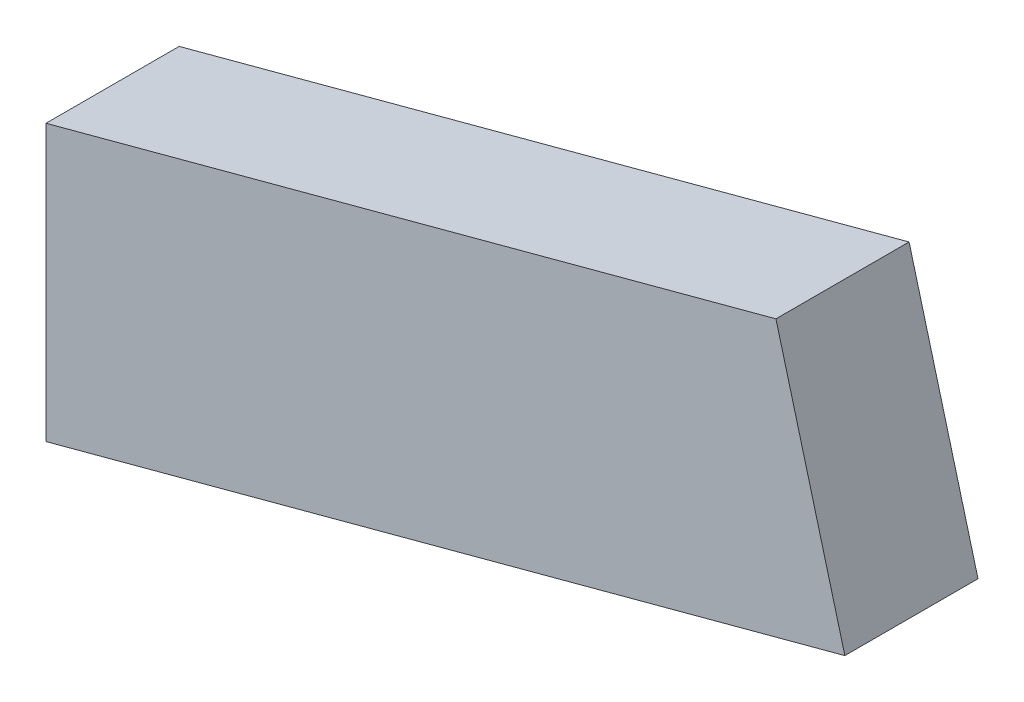
ISO-10303-21;
HEADER;
FILE_DESCRIPTION(('STEP AP214'),'2;1');
FILE_NAME('part.step','',(''),(''),'','','');
FILE_SCHEMA(('AUTOMOTIVE_DESIGN { 1 0 10303 214 1 1 1 1 }'));
ENDSEC;
DATA;
#1=APPLICATION_CONTEXT('core data for automotive mechanical design processes');
#2=APPLICATION_PROTOCOL_DEFINITION('international standard','automotive_design',2000,#1);
#3=PRODUCT_CONTEXT('',#1,'mechanical');
#4=PRODUCT('Part','Part','',(#3));
#5=PRODUCT_RELATED_PRODUCT_CATEGORY('part','',(#4));
#6=PRODUCT_DEFINITION_FORMATION('','',#4);
#7=PRODUCT_DEFINITION_CONTEXT('part definition',#1,'design');
#8=PRODUCT_DEFINITION('design','',#6,#7);
#9=PRODUCT_DEFINITION_SHAPE('','',#8);
#10=(LENGTH_UNIT() NAMED_UNIT(*) SI_UNIT(.MILLI.,.METRE.));
#11=(NAMED_UNIT(*) PLANE_ANGLE_UNIT() SI_UNIT($,.RADIAN.));
#12=(NAMED_UNIT(*) SI_UNIT($,.STERADIAN.) SOLID_ANGLE_UNIT());
#13=UNCERTAINTY_MEASURE_WITH_UNIT(LENGTH_MEASURE(1.E-05),#10,'distance_accuracy_value','');
#14=(GEOMETRIC_REPRESENTATION_CONTEXT(3) GLOBAL_UNCERTAINTY_ASSIGNED_CONTEXT((#13)) GLOBAL_UNIT_ASSIGNED_CONTEXT((#10,
#11,#12)) REPRESENTATION_CONTEXT('',''));
#15=CARTESIAN_POINT('',(0.,0.,0.));
#16=DIRECTION('',(0.,0.,1.));
#17=DIRECTION('',(1.,0.,0.));
#18=AXIS2_PLACEMENT_3D('',#15,#16,#17);
#19=CARTESIAN_POINT('',(0.,0.,0.5));
#20=DIRECTION('',(-0.258819045102525,0.965925826289067,0.));
#21=DIRECTION('',(-0.965925826289067,-0.258819045102525,0.));
#22=AXIS2_PLACEMENT_3D('',#19,#20,#21);
#23=PLANE('',#22);
#24=DIRECTION('',(0.965925826289067,0.258819045102525,0.));
#25=VECTOR('',#24,1.);
#26=CARTESIAN_POINT('',(0.,0.,0.));
#27=LINE('',#26,#25);
#28=CARTESIAN_POINT('',(0.,0.,0.));
#29=VERTEX_POINT('',#28);
#30=CARTESIAN_POINT('',(3.,0.803847577293382,0.));
#31=VERTEX_POINT('',#30);
#32=EDGE_CURVE('E100',#29,#31,#27,.T.);
#33=ORIENTED_EDGE('',*,*,#32,.T.);
#34=DIRECTION('',(0.,0.,-1.));
#35=VECTOR('',#34,1.);
#36=CARTESIAN_POINT('',(3.,0.803847577293382,0.5));
#37=LINE('',#36,#35);
#38=CARTESIAN_POINT('',(3.,0.803847577293382,0.5));
#39=VERTEX_POINT('',#38);
#40=EDGE_CURVE('E11',#39,#31,#37,.T.);
#41=ORIENTED_EDGE('',*,*,#40,.F.);
#42=DIRECTION('',(0.965925826289067,0.258819045102525,0.));
#43=VECTOR('',#42,1.);
#44=CARTESIAN_POINT('',(0.,0.,0.5));
#45=LINE('',#44,#43);
#46=CARTESIAN_POINT('',(0.,0.,0.5));
#47=VERTEX_POINT('',#46);
#48=EDGE_CURVE('E88',#47,#39,#45,.T.);
#49=ORIENTED_EDGE('',*,*,#48,.F.);
#50=DIRECTION('',(0.,0.,-1.));
#51=VECTOR('',#50,1.);
#52=CARTESIAN_POINT('',(0.,0.,0.5));
#53=LINE('',#52,#51);
#54=EDGE_CURVE('E96',#47,#29,#53,.T.);
#55=ORIENTED_EDGE('',*,*,#54,.T.);
#56=EDGE_LOOP('',(#33,#41,#49,#55));
#57=FACE_BOUND('',#56,.T.);
#58=ADVANCED_FACE('F37',(#57),#23,.F.);
#59=CARTESIAN_POINT('',(3.,0.803847577293382,0.5));
#60=DIRECTION('',(-0.965925826289067,-0.258819045102525,0.));
#61=DIRECTION('',(0.258819045102525,-0.965925826289067,0.));
#62=AXIS2_PLACEMENT_3D('',#59,#60,#61);
#63=PLANE('',#62);
#64=DIRECTION('',(-0.258819045102525,0.965925826289067,0.));
#65=VECTOR('',#64,1.);
#66=CARTESIAN_POINT('',(3.,0.803847577293382,0.));
#67=LINE('',#66,#65);
#68=CARTESIAN_POINT('',(2.74118095489748,1.76977340358245,0.));
#69=VERTEX_POINT('',#68);
#70=EDGE_CURVE('E92',#31,#69,#67,.T.);
#71=ORIENTED_EDGE('',*,*,#70,.T.);
#72=DIRECTION('',(0.,0.,-1.));
#73=VECTOR('',#72,1.);
#74=CARTESIAN_POINT('',(2.74118095489748,1.76977340358245,0.5));
#75=LINE('',#74,#73);
#76=CARTESIAN_POINT('',(2.74118095489748,1.76977340358245,0.5));
#77=VERTEX_POINT('',#76);
#78=EDGE_CURVE('E45',#77,#69,#75,.T.);
#79=ORIENTED_EDGE('',*,*,#78,.F.);
#80=DIRECTION('',(-0.258819045102525,0.965925826289067,0.));
#81=VECTOR('',#80,1.);
#82=CARTESIAN_POINT('',(3.,0.803847577293382,0.5));
#83=LINE('',#82,#81);
#84=EDGE_CURVE('E83',#39,#77,#83,.T.);
#85=ORIENTED_EDGE('',*,*,#84,.F.);
#86=ORIENTED_EDGE('',*,*,#40,.T.);
#87=EDGE_LOOP('',(#71,#79,#85,#86));
#88=FACE_BOUND('',#87,.T.);
#89=ADVANCED_FACE('F91',(#88),#63,.F.);
#90=CARTESIAN_POINT('',(2.74118095489748,1.76977340358245,0.5));
#91=DIRECTION('',(0.258819045102525,-0.965925826289067,0.));
#92=DIRECTION('',(0.965925826289067,0.258819045102525,0.));
#93=AXIS2_PLACEMENT_3D('',#90,#91,#92);
#94=PLANE('',#93);
#95=DIRECTION('',(-0.965925826289067,-0.258819045102525,0.));
#96=VECTOR('',#95,1.);
#97=CARTESIAN_POINT('',(2.74118095489748,1.76977340358245,0.));
#98=LINE('',#97,#96);
#99=CARTESIAN_POINT('',(0.,1.03527618041008,0.));
#100=VERTEX_POINT('',#99);
#101=EDGE_CURVE('E70',#69,#100,#98,.T.);
#102=ORIENTED_EDGE('',*,*,#101,.T.);
#103=DIRECTION('',(0.,0.,-1.));
#104=VECTOR('',#103,1.);
#105=CARTESIAN_POINT('',(0.,1.03527618041008,0.5));
#106=LINE('',#105,#104);
#107=CARTESIAN_POINT('',(0.,1.03527618041008,0.5));
#108=VERTEX_POINT('',#107);
#109=EDGE_CURVE('E93',#108,#100,#106,.T.);
#110=ORIENTED_EDGE('',*,*,#109,.F.);
#111=DIRECTION('',(-0.965925826289067,-0.258819045102525,0.));
#112=VECTOR('',#111,1.);
#113=CARTESIAN_POINT('',(2.74118095489748,1.76977340358245,0.5));
#114=LINE('',#113,#112);
#115=EDGE_CURVE('E86',#77,#108,#114,.T.);
#116=ORIENTED_EDGE('',*,*,#115,.F.);
#117=ORIENTED_EDGE('',*,*,#78,.T.);
#118=EDGE_LOOP('',(#102,#110,#116,#117));
#119=FACE_BOUND('',#118,.T.);
#120=ADVANCED_FACE('F94',(#119),#94,.F.);
#121=CARTESIAN_POINT('',(0.,0.,0.5));
#122=DIRECTION('',(1.,0.,0.));
#123=DIRECTION('',(0.,0.,-1.));
#124=AXIS2_PLACEMENT_3D('',#121,#122,#123);
#125=PLANE('',#124);
#126=DIRECTION('',(0.,-1.,0.));
#127=VECTOR('',#126,1.);
#128=CARTESIAN_POINT('',(0.,0.,0.));
#129=LINE('',#128,#127);
#130=EDGE_CURVE('E76',#100,#29,#129,.T.);
#131=ORIENTED_EDGE('',*,*,#130,.T.);
#132=ORIENTED_EDGE('',*,*,#54,.F.);
#133=DIRECTION('',(0.,-1.,0.));
#134=VECTOR('',#133,1.);
#135=CARTESIAN_POINT('',(0.,0.,0.5));
#136=LINE('',#135,#134);
#137=EDGE_CURVE('E53',#108,#47,#136,.T.);
#138=ORIENTED_EDGE('',*,*,#137,.F.);
#139=ORIENTED_EDGE('',*,*,#109,.T.);
#140=EDGE_LOOP('',(#131,#132,#138,#139));
#141=FACE_BOUND('',#140,.T.);
#142=ADVANCED_FACE('F107',(#141),#125,.F.);
#143=CARTESIAN_POINT('',(0.,0.,0.5));
#144=DIRECTION('',(0.,0.,1.));
#145=DIRECTION('',(1.,0.,0.));
#146=AXIS2_PLACEMENT_3D('',#143,#144,#145);
#147=PLANE('',#146);
#148=ORIENTED_EDGE('',*,*,#48,.T.);
#149=ORIENTED_EDGE('',*,*,#84,.T.);
#150=ORIENTED_EDGE('',*,*,#115,.T.);
#151=ORIENTED_EDGE('',*,*,#137,.T.);
#152=EDGE_LOOP('',(#148,#149,#150,#151));
#153=FACE_BOUND('',#152,.T.);
#154=ADVANCED_FACE('F84',(#153),#147,.T.);
#155=CARTESIAN_POINT('',(0.,0.,0.));
#156=DIRECTION('',(0.,0.,1.));
#157=DIRECTION('',(1.,0.,0.));
#158=AXIS2_PLACEMENT_3D('',#155,#156,#157);
#159=PLANE('',#158);
#160=ORIENTED_EDGE('',*,*,#32,.F.);
#161=ORIENTED_EDGE('',*,*,#130,.F.);
#162=ORIENTED_EDGE('',*,*,#101,.F.);
#163=ORIENTED_EDGE('',*,*,#70,.F.);
#164=EDGE_LOOP('',(#160,#161,#162,#163));
#165=FACE_BOUND('',#164,.T.);
#166=ADVANCED_FACE('F110',(#165),#159,.F.);
#167=CLOSED_SHELL('',(#58,#89,#120,#142,#154,#166));
#168=MANIFOLD_SOLID_BREP('B2',#167);
#169=ADVANCED_BREP_SHAPE_REPRESENTATION('',(#18,#168),#14);
#170=SHAPE_DEFINITION_REPRESENTATION(#9,#169);
ENDSEC;
END-ISO-10303-21;
